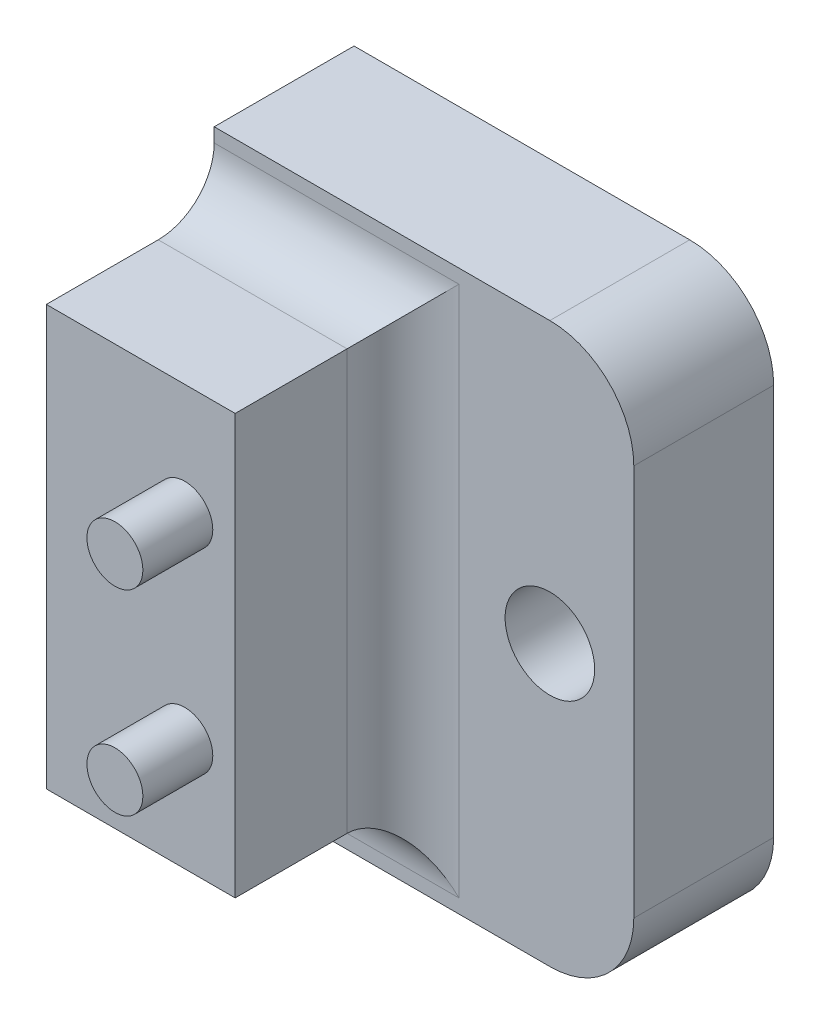
ISO-10303-21;
HEADER;
FILE_DESCRIPTION(('STEP AP214'),'2;1');
FILE_NAME('part.step','',(''),(''),'','','');
FILE_SCHEMA(('AUTOMOTIVE_DESIGN { 1 0 10303 214 1 1 1 1 }'));
ENDSEC;
DATA;
#1=APPLICATION_CONTEXT('core data for automotive mechanical design processes');
#2=APPLICATION_PROTOCOL_DEFINITION('international standard','automotive_design',2000,#1);
#3=PRODUCT_CONTEXT('',#1,'mechanical');
#4=PRODUCT('Part','Part','',(#3));
#5=PRODUCT_RELATED_PRODUCT_CATEGORY('part','',(#4));
#6=PRODUCT_DEFINITION_FORMATION('','',#4);
#7=PRODUCT_DEFINITION_CONTEXT('part definition',#1,'design');
#8=PRODUCT_DEFINITION('design','',#6,#7);
#9=PRODUCT_DEFINITION_SHAPE('','',#8);
#10=(LENGTH_UNIT() NAMED_UNIT(*) SI_UNIT(.MILLI.,.METRE.));
#11=(NAMED_UNIT(*) PLANE_ANGLE_UNIT() SI_UNIT($,.RADIAN.));
#12=(NAMED_UNIT(*) SI_UNIT($,.STERADIAN.) SOLID_ANGLE_UNIT());
#13=UNCERTAINTY_MEASURE_WITH_UNIT(LENGTH_MEASURE(1.E-05),#10,'distance_accuracy_value','');
#14=(GEOMETRIC_REPRESENTATION_CONTEXT(3) GLOBAL_UNCERTAINTY_ASSIGNED_CONTEXT((#13)) GLOBAL_UNIT_ASSIGNED_CONTEXT((#10,
#11,#12)) REPRESENTATION_CONTEXT('',''));
#15=CARTESIAN_POINT('',(0.,0.,0.));
#16=DIRECTION('',(0.,0.,1.));
#17=DIRECTION('',(1.,0.,0.));
#18=AXIS2_PLACEMENT_3D('',#15,#16,#17);
#19=CARTESIAN_POINT('',(12.,17.,5.));
#20=DIRECTION('',(0.,0.,-1.));
#21=DIRECTION('',(-1.,0.,0.));
#22=AXIS2_PLACEMENT_3D('',#19,#20,#21);
#23=PLANE('',#22);
#24=CARTESIAN_POINT('',(12.,10.,5.));
#25=DIRECTION('',(0.,0.,1.));
#26=DIRECTION('',(1.,0.,0.));
#27=AXIS2_PLACEMENT_3D('',#24,#25,#26);
#28=CIRCLE('',#27,1.6);
#29=CARTESIAN_POINT('',(13.6,10.,5.));
#30=VERTEX_POINT('',#29);
#31=EDGE_CURVE('E149',#30,#30,#28,.T.);
#32=ORIENTED_EDGE('',*,*,#31,.F.);
#33=EDGE_LOOP('',(#32));
#34=FACE_BOUND('',#33,.T.);
#35=DIRECTION('',(0.,-1.,0.));
#36=VECTOR('',#35,1.);
#37=CARTESIAN_POINT('',(0.,0.,5.));
#38=LINE('',#37,#36);
#39=CARTESIAN_POINT('',(0.,20.,5.));
#40=VERTEX_POINT('',#39);
#41=CARTESIAN_POINT('',(0.,19.5,5.));
#42=VERTEX_POINT('',#41);
#43=EDGE_CURVE('E158',#40,#42,#38,.T.);
#44=ORIENTED_EDGE('',*,*,#43,.T.);
#45=DIRECTION('',(-1.,0.,0.));
#46=VECTOR('',#45,1.);
#47=CARTESIAN_POINT('',(6.75,19.5,5.));
#48=LINE('',#47,#46);
#49=CARTESIAN_POINT('',(8.75,19.5,5.));
#50=VERTEX_POINT('',#49);
#51=EDGE_CURVE('E208',#42,#50,#48,.F.);
#52=ORIENTED_EDGE('',*,*,#51,.T.);
#53=DIRECTION('',(0.,1.,0.));
#54=VECTOR('',#53,1.);
#55=CARTESIAN_POINT('',(8.75,2.5,5.));
#56=LINE('',#55,#54);
#57=CARTESIAN_POINT('',(8.75,0.500000000000002,5.));
#58=VERTEX_POINT('',#57);
#59=EDGE_CURVE('E206',#50,#58,#56,.F.);
#60=ORIENTED_EDGE('',*,*,#59,.T.);
#61=DIRECTION('',(1.,0.,0.));
#62=VECTOR('',#61,1.);
#63=CARTESIAN_POINT('',(0.,0.500000000000002,5.));
#64=LINE('',#63,#62);
#65=CARTESIAN_POINT('',(0.,0.500000000000002,5.));
#66=VERTEX_POINT('',#65);
#67=EDGE_CURVE('E204',#58,#66,#64,.F.);
#68=ORIENTED_EDGE('',*,*,#67,.T.);
#69=CARTESIAN_POINT('',(0.,0.,5.));
#70=VERTEX_POINT('',#69);
#71=EDGE_CURVE('E162',#66,#70,#38,.T.);
#72=ORIENTED_EDGE('',*,*,#71,.T.);
#73=DIRECTION('',(1.,0.,0.));
#74=VECTOR('',#73,1.);
#75=CARTESIAN_POINT('',(0.,0.,5.));
#76=LINE('',#75,#74);
#77=CARTESIAN_POINT('',(12.,0.,5.));
#78=VERTEX_POINT('',#77);
#79=EDGE_CURVE('E161',#70,#78,#76,.T.);
#80=ORIENTED_EDGE('',*,*,#79,.T.);
#81=CARTESIAN_POINT('',(12.,3.,5.));
#82=DIRECTION('',(0.,0.,1.));
#83=DIRECTION('',(1.,0.,0.));
#84=AXIS2_PLACEMENT_3D('',#81,#82,#83);
#85=CIRCLE('',#84,3.);
#86=CARTESIAN_POINT('',(15.,3.,5.));
#87=VERTEX_POINT('',#86);
#88=EDGE_CURVE('E164',#78,#87,#85,.T.);
#89=ORIENTED_EDGE('',*,*,#88,.T.);
#90=DIRECTION('',(0.,1.,0.));
#91=VECTOR('',#90,1.);
#92=CARTESIAN_POINT('',(15.,3.00000000000002,5.));
#93=LINE('',#92,#91);
#94=CARTESIAN_POINT('',(15.,17.,5.));
#95=VERTEX_POINT('',#94);
#96=EDGE_CURVE('E166',#87,#95,#93,.T.);
#97=ORIENTED_EDGE('',*,*,#96,.T.);
#98=CARTESIAN_POINT('',(12.,17.,5.));
#99=DIRECTION('',(0.,0.,1.));
#100=DIRECTION('',(-1.,0.,0.));
#101=AXIS2_PLACEMENT_3D('',#98,#99,#100);
#102=CIRCLE('',#101,3.);
#103=CARTESIAN_POINT('',(12.,20.,5.));
#104=VERTEX_POINT('',#103);
#105=EDGE_CURVE('E168',#95,#104,#102,.T.);
#106=ORIENTED_EDGE('',*,*,#105,.T.);
#107=DIRECTION('',(-1.,0.,0.));
#108=VECTOR('',#107,1.);
#109=CARTESIAN_POINT('',(0.,20.,5.));
#110=LINE('',#109,#108);
#111=EDGE_CURVE('E170',#104,#40,#110,.T.);
#112=ORIENTED_EDGE('',*,*,#111,.T.);
#113=EDGE_LOOP('',(#44,#52,#60,#68,#72,#80,#89,#97,#106,#112));
#114=FACE_BOUND('',#113,.T.);
#115=ADVANCED_FACE('F38',(#34,#114),#23,.F.);
#116=CARTESIAN_POINT('',(12.,17.,0.));
#117=DIRECTION('',(0.,0.,-1.));
#118=DIRECTION('',(-1.,0.,0.));
#119=AXIS2_PLACEMENT_3D('',#116,#117,#118);
#120=PLANE('',#119);
#121=DIRECTION('',(0.,-1.,0.));
#122=VECTOR('',#121,1.);
#123=CARTESIAN_POINT('',(0.,0.,0.));
#124=LINE('',#123,#122);
#125=CARTESIAN_POINT('',(0.,20.,0.));
#126=VERTEX_POINT('',#125);
#127=CARTESIAN_POINT('',(0.,0.,0.));
#128=VERTEX_POINT('',#127);
#129=EDGE_CURVE('E156',#126,#128,#124,.T.);
#130=ORIENTED_EDGE('',*,*,#129,.F.);
#131=DIRECTION('',(-1.,0.,0.));
#132=VECTOR('',#131,1.);
#133=CARTESIAN_POINT('',(0.,20.,0.));
#134=LINE('',#133,#132);
#135=CARTESIAN_POINT('',(12.,20.,0.));
#136=VERTEX_POINT('',#135);
#137=EDGE_CURVE('E182',#136,#126,#134,.T.);
#138=ORIENTED_EDGE('',*,*,#137,.F.);
#139=CARTESIAN_POINT('',(12.,17.,0.));
#140=DIRECTION('',(0.,0.,1.));
#141=DIRECTION('',(-1.,0.,0.));
#142=AXIS2_PLACEMENT_3D('',#139,#140,#141);
#143=CIRCLE('',#142,3.);
#144=CARTESIAN_POINT('',(15.,17.,0.));
#145=VERTEX_POINT('',#144);
#146=EDGE_CURVE('E180',#145,#136,#143,.T.);
#147=ORIENTED_EDGE('',*,*,#146,.F.);
#148=DIRECTION('',(0.,1.,0.));
#149=VECTOR('',#148,1.);
#150=CARTESIAN_POINT('',(15.,3.00000000000002,0.));
#151=LINE('',#150,#149);
#152=CARTESIAN_POINT('',(15.,3.,0.));
#153=VERTEX_POINT('',#152);
#154=EDGE_CURVE('E178',#153,#145,#151,.T.);
#155=ORIENTED_EDGE('',*,*,#154,.F.);
#156=CARTESIAN_POINT('',(12.,3.,0.));
#157=DIRECTION('',(0.,0.,1.));
#158=DIRECTION('',(1.,0.,0.));
#159=AXIS2_PLACEMENT_3D('',#156,#157,#158);
#160=CIRCLE('',#159,3.);
#161=CARTESIAN_POINT('',(12.,0.,0.));
#162=VERTEX_POINT('',#161);
#163=EDGE_CURVE('E176',#162,#153,#160,.T.);
#164=ORIENTED_EDGE('',*,*,#163,.F.);
#165=DIRECTION('',(1.,0.,0.));
#166=VECTOR('',#165,1.);
#167=CARTESIAN_POINT('',(0.,0.,0.));
#168=LINE('',#167,#166);
#169=EDGE_CURVE('E174',#128,#162,#168,.T.);
#170=ORIENTED_EDGE('',*,*,#169,.F.);
#171=EDGE_LOOP('',(#130,#138,#147,#155,#164,#170));
#172=FACE_BOUND('',#171,.T.);
#173=CARTESIAN_POINT('',(12.,10.,0.));
#174=DIRECTION('',(0.,0.,1.));
#175=DIRECTION('',(1.,0.,0.));
#176=AXIS2_PLACEMENT_3D('',#173,#174,#175);
#177=CIRCLE('',#176,1.6);
#178=CARTESIAN_POINT('',(13.6,10.,0.));
#179=VERTEX_POINT('',#178);
#180=EDGE_CURVE('E146',#179,#179,#177,.T.);
#181=ORIENTED_EDGE('',*,*,#180,.T.);
#182=EDGE_LOOP('',(#181));
#183=FACE_BOUND('',#182,.T.);
#184=ADVANCED_FACE('F258',(#172,#183),#120,.T.);
#185=CARTESIAN_POINT('',(0.,0.,5.));
#186=DIRECTION('',(1.,0.,0.));
#187=DIRECTION('',(0.,0.,-1.));
#188=AXIS2_PLACEMENT_3D('',#185,#186,#187);
#189=PLANE('',#188);
#190=ORIENTED_EDGE('',*,*,#129,.T.);
#191=DIRECTION('',(0.,0.,-1.));
#192=VECTOR('',#191,1.);
#193=CARTESIAN_POINT('',(0.,0.,5.));
#194=LINE('',#193,#192);
#195=EDGE_CURVE('E198',#70,#128,#194,.T.);
#196=ORIENTED_EDGE('',*,*,#195,.F.);
#197=ORIENTED_EDGE('',*,*,#71,.F.);
#198=CARTESIAN_POINT('',(0.,0.500000000000002,7.));
#199=DIRECTION('',(1.,0.,0.));
#200=DIRECTION('',(0.,0.,-1.));
#201=AXIS2_PLACEMENT_3D('',#198,#199,#200);
#202=CIRCLE('',#201,2.);
#203=CARTESIAN_POINT('',(0.,2.5,7.));
#204=VERTEX_POINT('',#203);
#205=EDGE_CURVE('E11',#66,#204,#202,.T.);
#206=ORIENTED_EDGE('',*,*,#205,.T.);
#207=DIRECTION('',(0.,0.,-1.));
#208=VECTOR('',#207,1.);
#209=CARTESIAN_POINT('',(0.,2.5,11.));
#210=LINE('',#209,#208);
#211=CARTESIAN_POINT('',(0.,2.5,11.));
#212=VERTEX_POINT('',#211);
#213=EDGE_CURVE('E130',#212,#204,#210,.T.);
#214=ORIENTED_EDGE('',*,*,#213,.F.);
#215=DIRECTION('',(0.,-1.,0.));
#216=VECTOR('',#215,1.);
#217=CARTESIAN_POINT('',(0.,17.5,11.));
#218=LINE('',#217,#216);
#219=CARTESIAN_POINT('',(0.,17.5,11.));
#220=VERTEX_POINT('',#219);
#221=EDGE_CURVE('E135',#220,#212,#218,.T.);
#222=ORIENTED_EDGE('',*,*,#221,.F.);
#223=DIRECTION('',(0.,0.,-1.));
#224=VECTOR('',#223,1.);
#225=CARTESIAN_POINT('',(0.,17.5,11.));
#226=LINE('',#225,#224);
#227=CARTESIAN_POINT('',(0.,17.5,7.));
#228=VERTEX_POINT('',#227);
#229=EDGE_CURVE('E235',#220,#228,#226,.T.);
#230=ORIENTED_EDGE('',*,*,#229,.T.);
#231=CARTESIAN_POINT('',(0.,19.5,7.));
#232=DIRECTION('',(1.,0.,0.));
#233=DIRECTION('',(0.,0.,-1.));
#234=AXIS2_PLACEMENT_3D('',#231,#232,#233);
#235=CIRCLE('',#234,2.);
#236=EDGE_CURVE('E47',#228,#42,#235,.T.);
#237=ORIENTED_EDGE('',*,*,#236,.T.);
#238=ORIENTED_EDGE('',*,*,#43,.F.);
#239=DIRECTION('',(0.,0.,-1.));
#240=VECTOR('',#239,1.);
#241=CARTESIAN_POINT('',(0.,20.,5.));
#242=LINE('',#241,#240);
#243=EDGE_CURVE('E172',#40,#126,#242,.T.);
#244=ORIENTED_EDGE('',*,*,#243,.T.);
#245=EDGE_LOOP('',(#190,#196,#197,#206,#214,#222,#230,#237,#238,#244));
#246=FACE_BOUND('',#245,.T.);
#247=ADVANCED_FACE('F145',(#246),#189,.F.);
#248=CARTESIAN_POINT('',(0.,0.,5.));
#249=DIRECTION('',(0.,1.,0.));
#250=DIRECTION('',(0.,0.,1.));
#251=AXIS2_PLACEMENT_3D('',#248,#249,#250);
#252=PLANE('',#251);
#253=ORIENTED_EDGE('',*,*,#169,.T.);
#254=DIRECTION('',(0.,0.,-1.));
#255=VECTOR('',#254,1.);
#256=CARTESIAN_POINT('',(12.,0.,5.));
#257=LINE('',#256,#255);
#258=EDGE_CURVE('E195',#78,#162,#257,.T.);
#259=ORIENTED_EDGE('',*,*,#258,.F.);
#260=ORIENTED_EDGE('',*,*,#79,.F.);
#261=ORIENTED_EDGE('',*,*,#195,.T.);
#262=EDGE_LOOP('',(#253,#259,#260,#261));
#263=FACE_BOUND('',#262,.T.);
#264=ADVANCED_FACE('F266',(#263),#252,.F.);
#265=CARTESIAN_POINT('',(12.,3.,5.));
#266=DIRECTION('',(0.,0.,-1.));
#267=DIRECTION('',(-1.,0.,0.));
#268=AXIS2_PLACEMENT_3D('',#265,#266,#267);
#269=CYLINDRICAL_SURFACE('',#268,3.);
#270=ORIENTED_EDGE('',*,*,#163,.T.);
#271=DIRECTION('',(0.,0.,-1.));
#272=VECTOR('',#271,1.);
#273=CARTESIAN_POINT('',(15.,3.,5.));
#274=LINE('',#273,#272);
#275=EDGE_CURVE('E192',#87,#153,#274,.T.);
#276=ORIENTED_EDGE('',*,*,#275,.F.);
#277=ORIENTED_EDGE('',*,*,#88,.F.);
#278=ORIENTED_EDGE('',*,*,#258,.T.);
#279=EDGE_LOOP('',(#270,#276,#277,#278));
#280=FACE_BOUND('',#279,.T.);
#281=ADVANCED_FACE('F298',(#280),#269,.T.);
#282=CARTESIAN_POINT('',(15.,3.00000000000002,5.));
#283=DIRECTION('',(-1.,0.,0.));
#284=DIRECTION('',(0.,0.,1.));
#285=AXIS2_PLACEMENT_3D('',#282,#283,#284);
#286=PLANE('',#285);
#287=ORIENTED_EDGE('',*,*,#154,.T.);
#288=DIRECTION('',(0.,0.,-1.));
#289=VECTOR('',#288,1.);
#290=CARTESIAN_POINT('',(15.,17.,5.));
#291=LINE('',#290,#289);
#292=EDGE_CURVE('E189',#95,#145,#291,.T.);
#293=ORIENTED_EDGE('',*,*,#292,.F.);
#294=ORIENTED_EDGE('',*,*,#96,.F.);
#295=ORIENTED_EDGE('',*,*,#275,.T.);
#296=EDGE_LOOP('',(#287,#293,#294,#295));
#297=FACE_BOUND('',#296,.T.);
#298=ADVANCED_FACE('F294',(#297),#286,.F.);
#299=CARTESIAN_POINT('',(12.,17.,5.));
#300=DIRECTION('',(0.,0.,-1.));
#301=DIRECTION('',(-1.,0.,0.));
#302=AXIS2_PLACEMENT_3D('',#299,#300,#301);
#303=CYLINDRICAL_SURFACE('',#302,3.);
#304=ORIENTED_EDGE('',*,*,#146,.T.);
#305=DIRECTION('',(0.,0.,-1.));
#306=VECTOR('',#305,1.);
#307=CARTESIAN_POINT('',(12.,20.,5.));
#308=LINE('',#307,#306);
#309=EDGE_CURVE('E186',#104,#136,#308,.T.);
#310=ORIENTED_EDGE('',*,*,#309,.F.);
#311=ORIENTED_EDGE('',*,*,#105,.F.);
#312=ORIENTED_EDGE('',*,*,#292,.T.);
#313=EDGE_LOOP('',(#304,#310,#311,#312));
#314=FACE_BOUND('',#313,.T.);
#315=ADVANCED_FACE('F291',(#314),#303,.T.);
#316=CARTESIAN_POINT('',(0.,20.,5.));
#317=DIRECTION('',(0.,-1.,0.));
#318=DIRECTION('',(0.,0.,-1.));
#319=AXIS2_PLACEMENT_3D('',#316,#317,#318);
#320=PLANE('',#319);
#321=ORIENTED_EDGE('',*,*,#137,.T.);
#322=ORIENTED_EDGE('',*,*,#243,.F.);
#323=ORIENTED_EDGE('',*,*,#111,.F.);
#324=ORIENTED_EDGE('',*,*,#309,.T.);
#325=EDGE_LOOP('',(#321,#322,#323,#324));
#326=FACE_BOUND('',#325,.T.);
#327=ADVANCED_FACE('F253',(#326),#320,.F.);
#328=CARTESIAN_POINT('',(12.,10.,5.));
#329=DIRECTION('',(0.,0.,-1.));
#330=DIRECTION('',(-1.,0.,0.));
#331=AXIS2_PLACEMENT_3D('',#328,#329,#330);
#332=CYLINDRICAL_SURFACE('',#331,1.6);
#333=ORIENTED_EDGE('',*,*,#31,.T.);
#334=EDGE_LOOP('',(#333));
#335=FACE_BOUND('',#334,.T.);
#336=ORIENTED_EDGE('',*,*,#180,.F.);
#337=EDGE_LOOP('',(#336));
#338=FACE_BOUND('',#337,.T.);
#339=ADVANCED_FACE('F286',(#335,#338),#332,.F.);
#340=CARTESIAN_POINT('',(0.,2.5,11.));
#341=DIRECTION('',(0.,1.,0.));
#342=DIRECTION('',(0.,0.,1.));
#343=AXIS2_PLACEMENT_3D('',#340,#341,#342);
#344=PLANE('',#343);
#345=ORIENTED_EDGE('',*,*,#213,.T.);
#346=DIRECTION('',(1.,0.,0.));
#347=VECTOR('',#346,1.);
#348=CARTESIAN_POINT('',(6.75,2.5,7.));
#349=LINE('',#348,#347);
#350=CARTESIAN_POINT('',(6.75,2.5,7.));
#351=VERTEX_POINT('',#350);
#352=EDGE_CURVE('E60',#204,#351,#349,.T.);
#353=ORIENTED_EDGE('',*,*,#352,.T.);
#354=DIRECTION('',(0.,0.,-1.));
#355=VECTOR('',#354,1.);
#356=CARTESIAN_POINT('',(6.75,2.5,11.));
#357=LINE('',#356,#355);
#358=CARTESIAN_POINT('',(6.75,2.5,11.));
#359=VERTEX_POINT('',#358);
#360=EDGE_CURVE('E131',#359,#351,#357,.T.);
#361=ORIENTED_EDGE('',*,*,#360,.F.);
#362=DIRECTION('',(1.,0.,0.));
#363=VECTOR('',#362,1.);
#364=CARTESIAN_POINT('',(0.,2.5,11.));
#365=LINE('',#364,#363);
#366=EDGE_CURVE('E127',#212,#359,#365,.T.);
#367=ORIENTED_EDGE('',*,*,#366,.F.);
#368=EDGE_LOOP('',(#345,#353,#361,#367));
#369=FACE_BOUND('',#368,.T.);
#370=ADVANCED_FACE('F129',(#369),#344,.F.);
#371=CARTESIAN_POINT('',(6.75,17.5,11.));
#372=DIRECTION('',(-1.,0.,0.));
#373=DIRECTION('',(0.,-1.,0.));
#374=AXIS2_PLACEMENT_3D('',#371,#372,#373);
#375=PLANE('',#374);
#376=ORIENTED_EDGE('',*,*,#360,.T.);
#377=DIRECTION('',(0.,1.,0.));
#378=VECTOR('',#377,1.);
#379=CARTESIAN_POINT('',(6.75,17.5,7.));
#380=LINE('',#379,#378);
#381=CARTESIAN_POINT('',(6.75,17.5,7.));
#382=VERTEX_POINT('',#381);
#383=EDGE_CURVE('E210',#351,#382,#380,.T.);
#384=ORIENTED_EDGE('',*,*,#383,.T.);
#385=DIRECTION('',(0.,0.,-1.));
#386=VECTOR('',#385,1.);
#387=CARTESIAN_POINT('',(6.75,17.5,11.));
#388=LINE('',#387,#386);
#389=CARTESIAN_POINT('',(6.75,17.5,11.));
#390=VERTEX_POINT('',#389);
#391=EDGE_CURVE('E151',#390,#382,#388,.T.);
#392=ORIENTED_EDGE('',*,*,#391,.F.);
#393=DIRECTION('',(0.,1.,0.));
#394=VECTOR('',#393,1.);
#395=CARTESIAN_POINT('',(6.75,17.5,11.));
#396=LINE('',#395,#394);
#397=EDGE_CURVE('E134',#359,#390,#396,.T.);
#398=ORIENTED_EDGE('',*,*,#397,.F.);
#399=EDGE_LOOP('',(#376,#384,#392,#398));
#400=FACE_BOUND('',#399,.T.);
#401=ADVANCED_FACE('F325',(#400),#375,.F.);
#402=CARTESIAN_POINT('',(0.,17.5,11.));
#403=DIRECTION('',(0.,-1.,0.));
#404=DIRECTION('',(0.,0.,-1.));
#405=AXIS2_PLACEMENT_3D('',#402,#403,#404);
#406=PLANE('',#405);
#407=ORIENTED_EDGE('',*,*,#391,.T.);
#408=DIRECTION('',(-1.,0.,0.));
#409=VECTOR('',#408,1.);
#410=CARTESIAN_POINT('',(0.,17.5,7.));
#411=LINE('',#410,#409);
#412=EDGE_CURVE('E201',#382,#228,#411,.T.);
#413=ORIENTED_EDGE('',*,*,#412,.T.);
#414=ORIENTED_EDGE('',*,*,#229,.F.);
#415=DIRECTION('',(-1.,0.,0.));
#416=VECTOR('',#415,1.);
#417=CARTESIAN_POINT('',(0.,17.5,11.));
#418=LINE('',#417,#416);
#419=EDGE_CURVE('E140',#390,#220,#418,.T.);
#420=ORIENTED_EDGE('',*,*,#419,.F.);
#421=EDGE_LOOP('',(#407,#413,#414,#420));
#422=FACE_BOUND('',#421,.T.);
#423=ADVANCED_FACE('F239',(#422),#406,.F.);
#424=CARTESIAN_POINT('',(0.,0.,11.));
#425=DIRECTION('',(0.,0.,1.));
#426=DIRECTION('',(1.,0.,0.));
#427=AXIS2_PLACEMENT_3D('',#424,#425,#426);
#428=PLANE('',#427);
#429=CARTESIAN_POINT('',(4.95023571002158,6.5,11.));
#430=DIRECTION('',(0.,0.,1.));
#431=DIRECTION('',(1.,0.,0.));
#432=AXIS2_PLACEMENT_3D('',#429,#430,#431);
#433=CIRCLE('',#432,1.);
#434=CARTESIAN_POINT('',(5.95023571002158,6.5,11.));
#435=VERTEX_POINT('',#434);
#436=EDGE_CURVE('E230',#435,#435,#433,.T.);
#437=ORIENTED_EDGE('',*,*,#436,.F.);
#438=EDGE_LOOP('',(#437));
#439=FACE_BOUND('',#438,.T.);
#440=CARTESIAN_POINT('',(4.95023571002158,13.5,11.));
#441=DIRECTION('',(0.,0.,1.));
#442=DIRECTION('',(1.,0.,0.));
#443=AXIS2_PLACEMENT_3D('',#440,#441,#442);
#444=CIRCLE('',#443,1.);
#445=CARTESIAN_POINT('',(5.95023571002158,13.5,11.));
#446=VERTEX_POINT('',#445);
#447=EDGE_CURVE('E222',#446,#446,#444,.T.);
#448=ORIENTED_EDGE('',*,*,#447,.F.);
#449=EDGE_LOOP('',(#448));
#450=FACE_BOUND('',#449,.T.);
#451=ORIENTED_EDGE('',*,*,#221,.T.);
#452=ORIENTED_EDGE('',*,*,#366,.T.);
#453=ORIENTED_EDGE('',*,*,#397,.T.);
#454=ORIENTED_EDGE('',*,*,#419,.T.);
#455=EDGE_LOOP('',(#451,#452,#453,#454));
#456=FACE_BOUND('',#455,.T.);
#457=ADVANCED_FACE('F138',(#439,#450,#456),#428,.T.);
#458=CARTESIAN_POINT('',(0.,0.500000000000002,7.));
#459=DIRECTION('',(-1.,0.,0.));
#460=DIRECTION('',(0.,0.,1.));
#461=AXIS2_PLACEMENT_3D('',#458,#459,#460);
#462=CYLINDRICAL_SURFACE('',#461,2.);
#463=ORIENTED_EDGE('',*,*,#205,.F.);
#464=ORIENTED_EDGE('',*,*,#67,.F.);
#465=CARTESIAN_POINT('',(8.75,0.500000000000001,7.));
#466=DIRECTION('',(-0.707106781186547,-0.707106781186548,0.));
#467=DIRECTION('',(-0.707106781186548,0.707106781186547,0.));
#468=AXIS2_PLACEMENT_3D('',#465,#466,#467);
#469=ELLIPSE('',#468,2.82842712474619,2.);
#470=EDGE_CURVE('E42',#351,#58,#469,.T.);
#471=ORIENTED_EDGE('',*,*,#470,.F.);
#472=ORIENTED_EDGE('',*,*,#352,.F.);
#473=EDGE_LOOP('',(#463,#464,#471,#472));
#474=FACE_BOUND('',#473,.T.);
#475=ADVANCED_FACE('F40',(#474),#462,.F.);
#476=CARTESIAN_POINT('',(8.75,17.5,7.));
#477=DIRECTION('',(0.,-1.,0.));
#478=DIRECTION('',(1.,0.,0.));
#479=AXIS2_PLACEMENT_3D('',#476,#477,#478);
#480=CYLINDRICAL_SURFACE('',#479,2.);
#481=ORIENTED_EDGE('',*,*,#470,.T.);
#482=ORIENTED_EDGE('',*,*,#59,.F.);
#483=CARTESIAN_POINT('',(8.75,19.5,7.));
#484=DIRECTION('',(0.707106781186548,-0.707106781186547,0.));
#485=DIRECTION('',(-0.707106781186547,-0.707106781186548,0.));
#486=AXIS2_PLACEMENT_3D('',#483,#484,#485);
#487=ELLIPSE('',#486,2.82842712474619,2.);
#488=EDGE_CURVE('E213',#382,#50,#487,.T.);
#489=ORIENTED_EDGE('',*,*,#488,.F.);
#490=ORIENTED_EDGE('',*,*,#383,.F.);
#491=EDGE_LOOP('',(#481,#482,#489,#490));
#492=FACE_BOUND('',#491,.T.);
#493=ADVANCED_FACE('F244',(#492),#480,.F.);
#494=CARTESIAN_POINT('',(0.,19.5,7.));
#495=DIRECTION('',(1.,0.,0.));
#496=DIRECTION('',(0.,0.,-1.));
#497=AXIS2_PLACEMENT_3D('',#494,#495,#496);
#498=CYLINDRICAL_SURFACE('',#497,2.);
#499=ORIENTED_EDGE('',*,*,#488,.T.);
#500=ORIENTED_EDGE('',*,*,#51,.F.);
#501=ORIENTED_EDGE('',*,*,#236,.F.);
#502=ORIENTED_EDGE('',*,*,#412,.F.);
#503=EDGE_LOOP('',(#499,#500,#501,#502));
#504=FACE_BOUND('',#503,.T.);
#505=ADVANCED_FACE('F245',(#504),#498,.F.);
#506=CARTESIAN_POINT('',(4.95023571002158,13.5,13.5));
#507=DIRECTION('',(0.,0.,-1.));
#508=DIRECTION('',(-1.,0.,0.));
#509=AXIS2_PLACEMENT_3D('',#506,#507,#508);
#510=CYLINDRICAL_SURFACE('',#509,1.);
#511=CARTESIAN_POINT('',(4.95023571002158,13.5,13.5));
#512=DIRECTION('',(0.,0.,1.));
#513=DIRECTION('',(1.,0.,0.));
#514=AXIS2_PLACEMENT_3D('',#511,#512,#513);
#515=CIRCLE('',#514,1.);
#516=CARTESIAN_POINT('',(5.95023571002158,13.5,13.5));
#517=VERTEX_POINT('',#516);
#518=EDGE_CURVE('E215',#517,#517,#515,.T.);
#519=ORIENTED_EDGE('',*,*,#518,.F.);
#520=EDGE_LOOP('',(#519));
#521=FACE_BOUND('',#520,.T.);
#522=ORIENTED_EDGE('',*,*,#447,.T.);
#523=EDGE_LOOP('',(#522));
#524=FACE_BOUND('',#523,.T.);
#525=ADVANCED_FACE('F308',(#521,#524),#510,.T.);
#526=CARTESIAN_POINT('',(4.95023571002158,13.5,13.5));
#527=DIRECTION('',(0.,0.,1.));
#528=DIRECTION('',(1.,0.,0.));
#529=AXIS2_PLACEMENT_3D('',#526,#527,#528);
#530=PLANE('',#529);
#531=ORIENTED_EDGE('',*,*,#518,.T.);
#532=EDGE_LOOP('',(#531));
#533=FACE_BOUND('',#532,.T.);
#534=ADVANCED_FACE('F312',(#533),#530,.T.);
#535=CARTESIAN_POINT('',(4.95023571002158,6.5,13.5));
#536=DIRECTION('',(0.,0.,-1.));
#537=DIRECTION('',(-1.,0.,0.));
#538=AXIS2_PLACEMENT_3D('',#535,#536,#537);
#539=CYLINDRICAL_SURFACE('',#538,1.);
#540=CARTESIAN_POINT('',(4.95023571002158,6.5,13.5));
#541=DIRECTION('',(0.,0.,1.));
#542=DIRECTION('',(1.,0.,0.));
#543=AXIS2_PLACEMENT_3D('',#540,#541,#542);
#544=CIRCLE('',#543,1.);
#545=CARTESIAN_POINT('',(5.95023571002158,6.5,13.5));
#546=VERTEX_POINT('',#545);
#547=EDGE_CURVE('E227',#546,#546,#544,.T.);
#548=ORIENTED_EDGE('',*,*,#547,.F.);
#549=EDGE_LOOP('',(#548));
#550=FACE_BOUND('',#549,.T.);
#551=ORIENTED_EDGE('',*,*,#436,.T.);
#552=EDGE_LOOP('',(#551));
#553=FACE_BOUND('',#552,.T.);
#554=ADVANCED_FACE('F318',(#550,#553),#539,.T.);
#555=CARTESIAN_POINT('',(4.95023571002158,6.5,13.5));
#556=DIRECTION('',(0.,0.,1.));
#557=DIRECTION('',(1.,0.,0.));
#558=AXIS2_PLACEMENT_3D('',#555,#556,#557);
#559=PLANE('',#558);
#560=ORIENTED_EDGE('',*,*,#547,.T.);
#561=EDGE_LOOP('',(#560));
#562=FACE_BOUND('',#561,.T.);
#563=ADVANCED_FACE('F436',(#562),#559,.T.);
#564=CLOSED_SHELL('',(#115,#184,#247,#264,#281,#298,#315,#327,#339,#370,#401,#423,#457,#475,
#493,#505,#525,#534,#554,#563));
#565=MANIFOLD_SOLID_BREP('B2',#564);
#566=ADVANCED_BREP_SHAPE_REPRESENTATION('',(#18,#565),#14);
#567=SHAPE_DEFINITION_REPRESENTATION(#9,#566);
ENDSEC;
END-ISO-10303-21;
